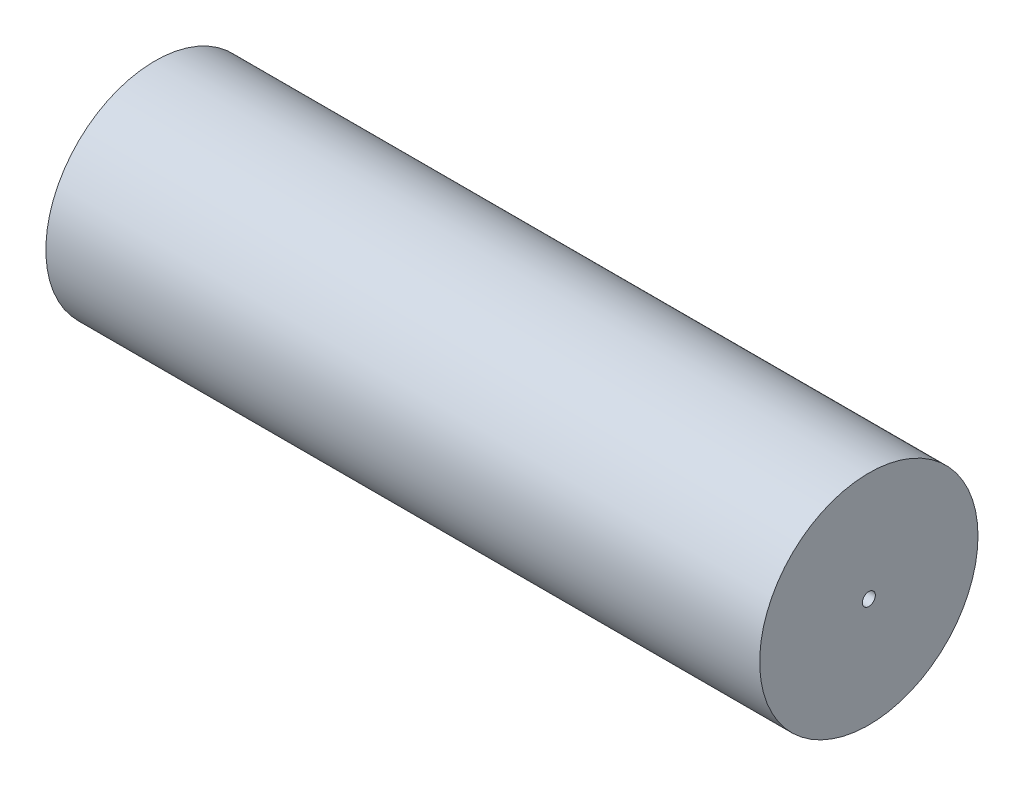
ISO-10303-21;
HEADER;
FILE_DESCRIPTION(('STEP AP214'),'2;1');
FILE_NAME('part.step','',(''),(''),'','','');
FILE_SCHEMA(('AUTOMOTIVE_DESIGN { 1 0 10303 214 1 1 1 1 }'));
ENDSEC;
DATA;
#1=APPLICATION_CONTEXT('core data for automotive mechanical design processes');
#2=APPLICATION_PROTOCOL_DEFINITION('international standard','automotive_design',2000,#1);
#3=PRODUCT_CONTEXT('',#1,'mechanical');
#4=PRODUCT('Part','Part','',(#3));
#5=PRODUCT_RELATED_PRODUCT_CATEGORY('part','',(#4));
#6=PRODUCT_DEFINITION_FORMATION('','',#4);
#7=PRODUCT_DEFINITION_CONTEXT('part definition',#1,'design');
#8=PRODUCT_DEFINITION('design','',#6,#7);
#9=PRODUCT_DEFINITION_SHAPE('','',#8);
#10=(LENGTH_UNIT() NAMED_UNIT(*) SI_UNIT(.MILLI.,.METRE.));
#11=(NAMED_UNIT(*) PLANE_ANGLE_UNIT() SI_UNIT($,.RADIAN.));
#12=(NAMED_UNIT(*) SI_UNIT($,.STERADIAN.) SOLID_ANGLE_UNIT());
#13=UNCERTAINTY_MEASURE_WITH_UNIT(LENGTH_MEASURE(1.E-05),#10,'distance_accuracy_value','');
#14=(GEOMETRIC_REPRESENTATION_CONTEXT(3) GLOBAL_UNCERTAINTY_ASSIGNED_CONTEXT((#13)) GLOBAL_UNIT_ASSIGNED_CONTEXT((#10,
#11,#12)) REPRESENTATION_CONTEXT('',''));
#15=CARTESIAN_POINT('',(0.,0.,0.));
#16=DIRECTION('',(0.,0.,1.));
#17=DIRECTION('',(1.,0.,0.));
#18=AXIS2_PLACEMENT_3D('',#15,#16,#17);
#19=CARTESIAN_POINT('',(170.,0.,0.));
#20=DIRECTION('',(-1.,0.,0.));
#21=DIRECTION('',(0.,0.,1.));
#22=AXIS2_PLACEMENT_3D('',#19,#20,#21);
#23=CYLINDRICAL_SURFACE('',#22,26.);
#24=CARTESIAN_POINT('',(170.,0.,0.));
#25=DIRECTION('',(1.,0.,0.));
#26=DIRECTION('',(0.,0.,-1.));
#27=AXIS2_PLACEMENT_3D('',#24,#25,#26);
#28=CIRCLE('',#27,26.);
#29=CARTESIAN_POINT('',(170.,0.,-26.));
#30=VERTEX_POINT('',#29);
#31=EDGE_CURVE('E10',#30,#30,#28,.T.);
#32=ORIENTED_EDGE('',*,*,#31,.F.);
#33=EDGE_LOOP('',(#32));
#34=FACE_BOUND('',#33,.T.);
#35=CARTESIAN_POINT('',(0.,0.,0.));
#36=DIRECTION('',(1.,0.,0.));
#37=DIRECTION('',(0.,0.,-1.));
#38=AXIS2_PLACEMENT_3D('',#35,#36,#37);
#39=CIRCLE('',#38,26.);
#40=CARTESIAN_POINT('',(0.,0.,-26.));
#41=VERTEX_POINT('',#40);
#42=EDGE_CURVE('E44',#41,#41,#39,.T.);
#43=ORIENTED_EDGE('',*,*,#42,.T.);
#44=EDGE_LOOP('',(#43));
#45=FACE_BOUND('',#44,.T.);
#46=ADVANCED_FACE('F41',(#34,#45),#23,.T.);
#47=CARTESIAN_POINT('',(170.,0.,0.));
#48=DIRECTION('',(1.,0.,0.));
#49=DIRECTION('',(0.,0.,-1.));
#50=AXIS2_PLACEMENT_3D('',#47,#48,#49);
#51=PLANE('',#50);
#52=CARTESIAN_POINT('',(170.,0.,0.));
#53=DIRECTION('',(1.,0.,0.));
#54=DIRECTION('',(0.,0.,-1.));
#55=AXIS2_PLACEMENT_3D('',#52,#53,#54);
#56=CIRCLE('',#55,1.55);
#57=CARTESIAN_POINT('',(170.,0.,-1.55));
#58=VERTEX_POINT('',#57);
#59=EDGE_CURVE('E55',#58,#58,#56,.T.);
#60=ORIENTED_EDGE('',*,*,#59,.F.);
#61=EDGE_LOOP('',(#60));
#62=FACE_BOUND('',#61,.T.);
#63=ORIENTED_EDGE('',*,*,#31,.T.);
#64=EDGE_LOOP('',(#63));
#65=FACE_BOUND('',#64,.T.);
#66=ADVANCED_FACE('F84',(#62,#65),#51,.T.);
#67=CARTESIAN_POINT('',(0.,0.,0.));
#68=DIRECTION('',(1.,0.,0.));
#69=DIRECTION('',(0.,0.,-1.));
#70=AXIS2_PLACEMENT_3D('',#67,#68,#69);
#71=PLANE('',#70);
#72=CARTESIAN_POINT('',(0.,0.,0.));
#73=DIRECTION('',(-1.,0.,0.));
#74=DIRECTION('',(0.,0.,1.));
#75=AXIS2_PLACEMENT_3D('',#72,#73,#74);
#76=CIRCLE('',#75,1.5);
#77=CARTESIAN_POINT('',(0.,0.,1.5));
#78=VERTEX_POINT('',#77);
#79=EDGE_CURVE('E63',#78,#78,#76,.T.);
#80=ORIENTED_EDGE('',*,*,#79,.F.);
#81=EDGE_LOOP('',(#80));
#82=FACE_BOUND('',#81,.T.);
#83=ORIENTED_EDGE('',*,*,#42,.F.);
#84=EDGE_LOOP('',(#83));
#85=FACE_BOUND('',#84,.T.);
#86=ADVANCED_FACE('F80',(#82,#85),#71,.F.);
#87=CARTESIAN_POINT('',(165.,0.,0.));
#88=DIRECTION('',(1.,0.,0.));
#89=DIRECTION('',(0.,0.,-1.));
#90=AXIS2_PLACEMENT_3D('',#87,#88,#89);
#91=CYLINDRICAL_SURFACE('',#90,1.55);
#92=CARTESIAN_POINT('',(165.,0.,0.));
#93=DIRECTION('',(1.,0.,0.));
#94=DIRECTION('',(0.,0.,-1.));
#95=AXIS2_PLACEMENT_3D('',#92,#93,#94);
#96=CIRCLE('',#95,1.55);
#97=CARTESIAN_POINT('',(165.,0.,-1.55));
#98=VERTEX_POINT('',#97);
#99=EDGE_CURVE('E53',#98,#98,#96,.T.);
#100=ORIENTED_EDGE('',*,*,#99,.F.);
#101=EDGE_LOOP('',(#100));
#102=FACE_BOUND('',#101,.T.);
#103=ORIENTED_EDGE('',*,*,#59,.T.);
#104=EDGE_LOOP('',(#103));
#105=FACE_BOUND('',#104,.T.);
#106=ADVANCED_FACE('F83',(#102,#105),#91,.F.);
#107=CARTESIAN_POINT('',(165.,0.,0.));
#108=DIRECTION('',(1.,0.,0.));
#109=DIRECTION('',(0.,0.,-1.));
#110=AXIS2_PLACEMENT_3D('',#107,#108,#109);
#111=PLANE('',#110);
#112=ORIENTED_EDGE('',*,*,#99,.T.);
#113=EDGE_LOOP('',(#112));
#114=FACE_BOUND('',#113,.T.);
#115=ADVANCED_FACE('F76',(#114),#111,.T.);
#116=CARTESIAN_POINT('',(5.,0.,0.));
#117=DIRECTION('',(-1.,0.,0.));
#118=DIRECTION('',(0.,0.,1.));
#119=AXIS2_PLACEMENT_3D('',#116,#117,#118);
#120=CYLINDRICAL_SURFACE('',#119,1.5);
#121=CARTESIAN_POINT('',(5.,0.,0.));
#122=DIRECTION('',(-1.,0.,0.));
#123=DIRECTION('',(0.,0.,1.));
#124=AXIS2_PLACEMENT_3D('',#121,#122,#123);
#125=CIRCLE('',#124,1.5);
#126=CARTESIAN_POINT('',(5.,0.,1.5));
#127=VERTEX_POINT('',#126);
#128=EDGE_CURVE('E59',#127,#127,#125,.T.);
#129=ORIENTED_EDGE('',*,*,#128,.F.);
#130=EDGE_LOOP('',(#129));
#131=FACE_BOUND('',#130,.T.);
#132=ORIENTED_EDGE('',*,*,#79,.T.);
#133=EDGE_LOOP('',(#132));
#134=FACE_BOUND('',#133,.T.);
#135=ADVANCED_FACE('F73',(#131,#134),#120,.F.);
#136=CARTESIAN_POINT('',(5.,0.,0.));
#137=DIRECTION('',(-1.,0.,0.));
#138=DIRECTION('',(0.,0.,1.));
#139=AXIS2_PLACEMENT_3D('',#136,#137,#138);
#140=PLANE('',#139);
#141=ORIENTED_EDGE('',*,*,#128,.T.);
#142=EDGE_LOOP('',(#141));
#143=FACE_BOUND('',#142,.T.);
#144=ADVANCED_FACE('F71',(#143),#140,.T.);
#145=CLOSED_SHELL('',(#46,#66,#86,#106,#115,#135,#144));
#146=MANIFOLD_SOLID_BREP('B2',#145);
#147=ADVANCED_BREP_SHAPE_REPRESENTATION('',(#18,#146),#14);
#148=SHAPE_DEFINITION_REPRESENTATION(#9,#147);
ENDSEC;
END-ISO-10303-21;
